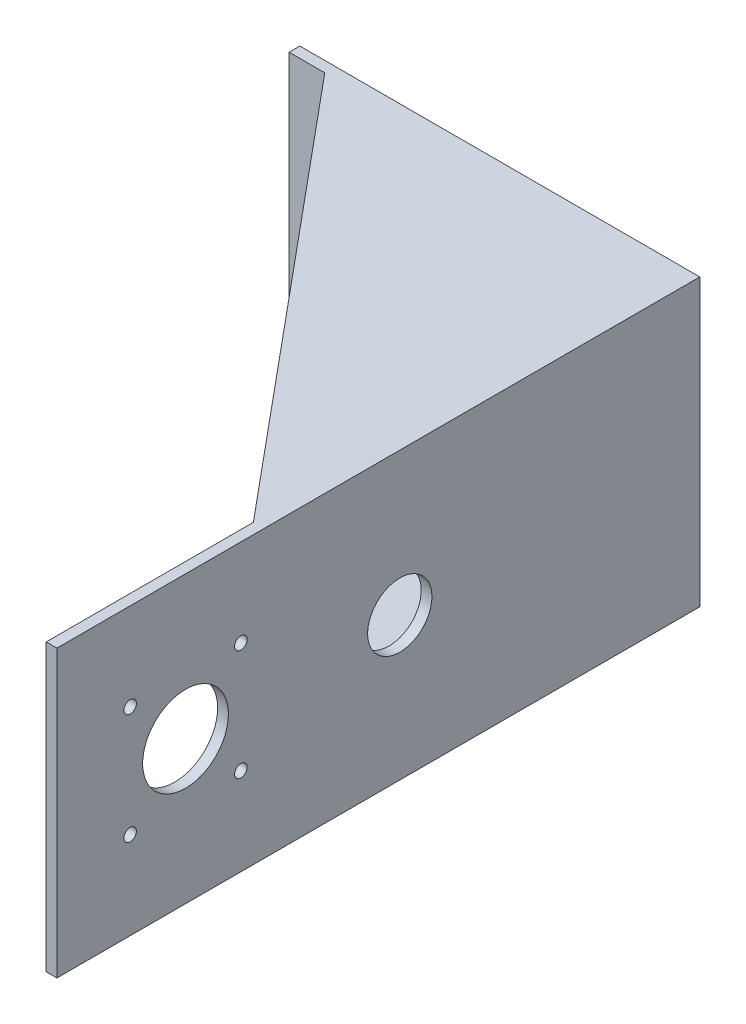
ISO-10303-21;
HEADER;
FILE_DESCRIPTION(('STEP AP214'),'2;1');
FILE_NAME('part.step','',(''),(''),'','','');
FILE_SCHEMA(('AUTOMOTIVE_DESIGN { 1 0 10303 214 1 1 1 1 }'));
ENDSEC;
DATA;
#1=APPLICATION_CONTEXT('core data for automotive mechanical design processes');
#2=APPLICATION_PROTOCOL_DEFINITION('international standard','automotive_design',2000,#1);
#3=PRODUCT_CONTEXT('',#1,'mechanical');
#4=PRODUCT('Part','Part','',(#3));
#5=PRODUCT_RELATED_PRODUCT_CATEGORY('part','',(#4));
#6=PRODUCT_DEFINITION_FORMATION('','',#4);
#7=PRODUCT_DEFINITION_CONTEXT('part definition',#1,'design');
#8=PRODUCT_DEFINITION('design','',#6,#7);
#9=PRODUCT_DEFINITION_SHAPE('','',#8);
#10=(LENGTH_UNIT() NAMED_UNIT(*) SI_UNIT(.MILLI.,.METRE.));
#11=(NAMED_UNIT(*) PLANE_ANGLE_UNIT() SI_UNIT($,.RADIAN.));
#12=(NAMED_UNIT(*) SI_UNIT($,.STERADIAN.) SOLID_ANGLE_UNIT());
#13=UNCERTAINTY_MEASURE_WITH_UNIT(LENGTH_MEASURE(1.E-05),#10,'distance_accuracy_value','');
#14=(GEOMETRIC_REPRESENTATION_CONTEXT(3) GLOBAL_UNCERTAINTY_ASSIGNED_CONTEXT((#13)) GLOBAL_UNIT_ASSIGNED_CONTEXT((#10,
#11,#12)) REPRESENTATION_CONTEXT('',''));
#15=CARTESIAN_POINT('',(0.,0.,0.));
#16=DIRECTION('',(0.,0.,1.));
#17=DIRECTION('',(1.,0.,0.));
#18=AXIS2_PLACEMENT_3D('',#15,#16,#17);
#19=CARTESIAN_POINT('',(25.,40.,0.001899999999978));
#20=DIRECTION('',(0.,0.,1.));
#21=DIRECTION('',(1.,0.,0.));
#22=AXIS2_PLACEMENT_3D('',#19,#20,#21);
#23=CYLINDRICAL_SURFACE('',#22,2.75);
#24=CARTESIAN_POINT('',(25.,40.,0.001899999999978));
#25=DIRECTION('',(0.,0.,1.));
#26=DIRECTION('',(1.,0.,0.));
#27=AXIS2_PLACEMENT_3D('',#24,#25,#26);
#28=CIRCLE('',#27,2.75);
#29=CARTESIAN_POINT('',(27.75,40.,0.001899999999978));
#30=VERTEX_POINT('',#29);
#31=EDGE_CURVE('E158',#30,#30,#28,.F.);
#32=ORIENTED_EDGE('',*,*,#31,.T.);
#33=EDGE_LOOP('',(#32));
#34=FACE_BOUND('',#33,.T.);
#35=CARTESIAN_POINT('',(25.,40.,3.0019));
#36=DIRECTION('',(0.,0.,1.));
#37=DIRECTION('',(1.,0.,0.));
#38=AXIS2_PLACEMENT_3D('',#35,#36,#37);
#39=CIRCLE('',#38,2.75);
#40=CARTESIAN_POINT('',(27.75,40.,3.0019));
#41=VERTEX_POINT('',#40);
#42=EDGE_CURVE('E18',#41,#41,#39,.F.);
#43=ORIENTED_EDGE('',*,*,#42,.F.);
#44=EDGE_LOOP('',(#43));
#45=FACE_BOUND('',#44,.T.);
#46=ADVANCED_FACE('F15',(#34,#45),#23,.F.);
#47=CARTESIAN_POINT('',(85.,40.,0.001899999999978));
#48=DIRECTION('',(0.,0.,1.));
#49=DIRECTION('',(1.,0.,0.));
#50=AXIS2_PLACEMENT_3D('',#47,#48,#49);
#51=CYLINDRICAL_SURFACE('',#50,2.75);
#52=CARTESIAN_POINT('',(85.,40.,0.001899999999978));
#53=DIRECTION('',(0.,0.,1.));
#54=DIRECTION('',(1.,0.,0.));
#55=AXIS2_PLACEMENT_3D('',#52,#53,#54);
#56=CIRCLE('',#55,2.75);
#57=CARTESIAN_POINT('',(87.75,40.,0.001899999999978));
#58=VERTEX_POINT('',#57);
#59=EDGE_CURVE('E154',#58,#58,#56,.F.);
#60=ORIENTED_EDGE('',*,*,#59,.T.);
#61=EDGE_LOOP('',(#60));
#62=FACE_BOUND('',#61,.T.);
#63=CARTESIAN_POINT('',(85.,40.,3.0019));
#64=DIRECTION('',(0.,0.,1.));
#65=DIRECTION('',(1.,0.,0.));
#66=AXIS2_PLACEMENT_3D('',#63,#64,#65);
#67=CIRCLE('',#66,2.75);
#68=CARTESIAN_POINT('',(87.75,40.,3.0019));
#69=VERTEX_POINT('',#68);
#70=EDGE_CURVE('E161',#69,#69,#67,.F.);
#71=ORIENTED_EDGE('',*,*,#70,.F.);
#72=EDGE_LOOP('',(#71));
#73=FACE_BOUND('',#72,.T.);
#74=ADVANCED_FACE('F171',(#62,#73),#51,.F.);
#75=CARTESIAN_POINT('',(0.,0.,0.001899999999978));
#76=DIRECTION('',(1.,0.,0.));
#77=DIRECTION('',(0.,0.,-1.));
#78=AXIS2_PLACEMENT_3D('',#75,#76,#77);
#79=PLANE('',#78);
#80=DIRECTION('',(0.,0.,1.));
#81=VECTOR('',#80,1.);
#82=CARTESIAN_POINT('',(0.,80.,0.001899999999978));
#83=LINE('',#82,#81);
#84=CARTESIAN_POINT('',(0.,80.,0.001899999999978));
#85=VERTEX_POINT('',#84);
#86=CARTESIAN_POINT('',(0.,80.,3.0019));
#87=VERTEX_POINT('',#86);
#88=EDGE_CURVE('E250',#85,#87,#83,.T.);
#89=ORIENTED_EDGE('',*,*,#88,.F.);
#90=DIRECTION('',(0.,1.,0.));
#91=VECTOR('',#90,1.);
#92=CARTESIAN_POINT('',(0.,0.,0.001899999999978));
#93=LINE('',#92,#91);
#94=CARTESIAN_POINT('',(0.,0.,0.001899999999978));
#95=VERTEX_POINT('',#94);
#96=EDGE_CURVE('E252',#85,#95,#93,.F.);
#97=ORIENTED_EDGE('',*,*,#96,.T.);
#98=DIRECTION('',(0.,0.,1.));
#99=VECTOR('',#98,1.);
#100=CARTESIAN_POINT('',(0.,0.,0.001899999999978));
#101=LINE('',#100,#99);
#102=CARTESIAN_POINT('',(0.,0.,3.0019));
#103=VERTEX_POINT('',#102);
#104=EDGE_CURVE('E271',#95,#103,#101,.T.);
#105=ORIENTED_EDGE('',*,*,#104,.T.);
#106=DIRECTION('',(0.,1.,0.));
#107=VECTOR('',#106,1.);
#108=CARTESIAN_POINT('',(0.,0.,3.0019));
#109=LINE('',#108,#107);
#110=EDGE_CURVE('E103',#87,#103,#109,.F.);
#111=ORIENTED_EDGE('',*,*,#110,.F.);
#112=EDGE_LOOP('',(#89,#97,#105,#111));
#113=FACE_BOUND('',#112,.T.);
#114=ADVANCED_FACE('F177',(#113),#79,.F.);
#115=CARTESIAN_POINT('',(109.,3.,122.0019));
#116=DIRECTION('',(0.768750532261908,0.,-0.639548762133923));
#117=DIRECTION('',(-0.639548762133923,0.,-0.768750532261908));
#118=AXIS2_PLACEMENT_3D('',#115,#116,#117);
#119=PLANE('',#118);
#120=DIRECTION('',(0.,1.,0.));
#121=VECTOR('',#120,1.);
#122=CARTESIAN_POINT('',(10.,0.,3.0019));
#123=LINE('',#122,#121);
#124=CARTESIAN_POINT('',(9.99999999999693,0.,3.00190000000257));
#125=VERTEX_POINT('',#124);
#126=CARTESIAN_POINT('',(9.99999999999691,3.,3.00190000000254));
#127=VERTEX_POINT('',#126);
#128=EDGE_CURVE('E97',#125,#127,#123,.T.);
#129=ORIENTED_EDGE('',*,*,#128,.F.);
#130=DIRECTION('',(-0.639548762133884,0.,-0.768750532261941));
#131=VECTOR('',#130,1.);
#132=CARTESIAN_POINT('',(109.,1.136868377216E-13,122.0019));
#133=LINE('',#132,#131);
#134=CARTESIAN_POINT('',(109.,0.,122.0019));
#135=VERTEX_POINT('',#134);
#136=EDGE_CURVE('E273',#135,#125,#133,.T.);
#137=ORIENTED_EDGE('',*,*,#136,.F.);
#138=DIRECTION('',(0.,1.,0.));
#139=VECTOR('',#138,1.);
#140=CARTESIAN_POINT('',(109.,0.,122.0019));
#141=LINE('',#140,#139);
#142=CARTESIAN_POINT('',(109.,3.,122.0019));
#143=VERTEX_POINT('',#142);
#144=EDGE_CURVE('E100',#135,#143,#141,.T.);
#145=ORIENTED_EDGE('',*,*,#144,.T.);
#146=DIRECTION('',(-0.639548762133884,0.,-0.768750532261941));
#147=VECTOR('',#146,1.);
#148=CARTESIAN_POINT('',(109.,3.,122.0019));
#149=LINE('',#148,#147);
#150=EDGE_CURVE('E93',#143,#127,#149,.T.);
#151=ORIENTED_EDGE('',*,*,#150,.T.);
#152=EDGE_LOOP('',(#129,#137,#145,#151));
#153=FACE_BOUND('',#152,.T.);
#154=ADVANCED_FACE('F95',(#153),#119,.F.);
#155=CARTESIAN_POINT('',(75.300839802394,3.,46.701060197606));
#156=DIRECTION('',(0.,-1.,0.));
#157=DIRECTION('',(0.,0.,-1.));
#158=AXIS2_PLACEMENT_3D('',#155,#156,#157);
#159=PLANE('',#158);
#160=DIRECTION('',(0.,0.,-1.));
#161=VECTOR('',#160,1.);
#162=CARTESIAN_POINT('',(109.,3.,3.0019));
#163=LINE('',#162,#161);
#164=CARTESIAN_POINT('',(109.,3.,3.0019));
#165=VERTEX_POINT('',#164);
#166=EDGE_CURVE('E108',#143,#165,#163,.T.);
#167=ORIENTED_EDGE('',*,*,#166,.T.);
#168=DIRECTION('',(1.,0.,0.));
#169=VECTOR('',#168,1.);
#170=CARTESIAN_POINT('',(0.,3.,3.0019));
#171=LINE('',#170,#169);
#172=EDGE_CURVE('E106',#127,#165,#171,.T.);
#173=ORIENTED_EDGE('',*,*,#172,.F.);
#174=ORIENTED_EDGE('',*,*,#150,.F.);
#175=EDGE_LOOP('',(#167,#173,#174));
#176=FACE_BOUND('',#175,.T.);
#177=ADVANCED_FACE('F107',(#176),#159,.F.);
#178=CARTESIAN_POINT('',(0.,0.,3.0019));
#179=DIRECTION('',(0.,0.,1.));
#180=DIRECTION('',(1.,0.,0.));
#181=AXIS2_PLACEMENT_3D('',#178,#179,#180);
#182=PLANE('',#181);
#183=ORIENTED_EDGE('',*,*,#70,.T.);
#184=EDGE_LOOP('',(#183));
#185=FACE_BOUND('',#184,.T.);
#186=ORIENTED_EDGE('',*,*,#42,.T.);
#187=EDGE_LOOP('',(#186));
#188=FACE_BOUND('',#187,.T.);
#189=DIRECTION('',(1.,0.,0.));
#190=VECTOR('',#189,1.);
#191=CARTESIAN_POINT('',(75.300839802394,77.,3.0019));
#192=LINE('',#191,#190);
#193=CARTESIAN_POINT('',(9.99999999999845,77.,3.00190000000128));
#194=VERTEX_POINT('',#193);
#195=CARTESIAN_POINT('',(109.,77.,3.0019));
#196=VERTEX_POINT('',#195);
#197=EDGE_CURVE('E88',#194,#196,#192,.T.);
#198=ORIENTED_EDGE('',*,*,#197,.F.);
#199=DIRECTION('',(0.,1.,0.));
#200=VECTOR('',#199,1.);
#201=CARTESIAN_POINT('',(9.99999999999383,80.,3.00190000000511));
#202=LINE('',#201,#200);
#203=CARTESIAN_POINT('',(9.99999999999923,80.,3.00190000000064));
#204=VERTEX_POINT('',#203);
#205=EDGE_CURVE('E275',#194,#204,#202,.T.);
#206=ORIENTED_EDGE('',*,*,#205,.T.);
#207=DIRECTION('',(1.,0.,0.));
#208=VECTOR('',#207,1.);
#209=CARTESIAN_POINT('',(0.,80.,3.0019));
#210=LINE('',#209,#208);
#211=EDGE_CURVE('E256',#87,#204,#210,.T.);
#212=ORIENTED_EDGE('',*,*,#211,.F.);
#213=ORIENTED_EDGE('',*,*,#110,.T.);
#214=DIRECTION('',(1.,0.,0.));
#215=VECTOR('',#214,1.);
#216=CARTESIAN_POINT('',(0.,0.,3.0019));
#217=LINE('',#216,#215);
#218=EDGE_CURVE('E114',#103,#125,#217,.T.);
#219=ORIENTED_EDGE('',*,*,#218,.T.);
#220=ORIENTED_EDGE('',*,*,#128,.T.);
#221=ORIENTED_EDGE('',*,*,#172,.T.);
#222=DIRECTION('',(0.,1.,0.));
#223=VECTOR('',#222,1.);
#224=CARTESIAN_POINT('',(109.,0.,3.0019));
#225=LINE('',#224,#223);
#226=EDGE_CURVE('E290',#165,#196,#225,.T.);
#227=ORIENTED_EDGE('',*,*,#226,.T.);
#228=EDGE_LOOP('',(#198,#206,#212,#213,#219,#220,#221,#227));
#229=FACE_BOUND('',#228,.T.);
#230=ADVANCED_FACE('F111',(#185,#188,#229),#182,.T.);
#231=CARTESIAN_POINT('',(75.300839802394,77.,46.701060197606));
#232=DIRECTION('',(0.,-1.,0.));
#233=DIRECTION('',(0.,0.,-1.));
#234=AXIS2_PLACEMENT_3D('',#231,#232,#233);
#235=PLANE('',#234);
#236=DIRECTION('',(0.,0.,-1.));
#237=VECTOR('',#236,1.);
#238=CARTESIAN_POINT('',(109.,77.,3.0019));
#239=LINE('',#238,#237);
#240=CARTESIAN_POINT('',(109.,77.,122.0019));
#241=VERTEX_POINT('',#240);
#242=EDGE_CURVE('E280',#196,#241,#239,.F.);
#243=ORIENTED_EDGE('',*,*,#242,.T.);
#244=DIRECTION('',(-0.639548762133923,0.,-0.768750532261908));
#245=VECTOR('',#244,1.);
#246=CARTESIAN_POINT('',(109.,77.,122.0019));
#247=LINE('',#246,#245);
#248=EDGE_CURVE('E165',#241,#194,#247,.T.);
#249=ORIENTED_EDGE('',*,*,#248,.T.);
#250=ORIENTED_EDGE('',*,*,#197,.T.);
#251=EDGE_LOOP('',(#243,#249,#250));
#252=FACE_BOUND('',#251,.T.);
#253=ADVANCED_FACE('F233',(#252),#235,.T.);
#254=CARTESIAN_POINT('',(109.,80.,122.0019));
#255=DIRECTION('',(0.768750532261908,0.,-0.639548762133923));
#256=DIRECTION('',(-0.639548762133923,0.,-0.768750532261908));
#257=AXIS2_PLACEMENT_3D('',#254,#255,#256);
#258=PLANE('',#257);
#259=ORIENTED_EDGE('',*,*,#205,.F.);
#260=ORIENTED_EDGE('',*,*,#248,.F.);
#261=DIRECTION('',(0.,1.,0.));
#262=VECTOR('',#261,1.);
#263=CARTESIAN_POINT('',(109.,0.,122.0019));
#264=LINE('',#263,#262);
#265=CARTESIAN_POINT('',(109.,80.,122.0019));
#266=VERTEX_POINT('',#265);
#267=EDGE_CURVE('E293',#241,#266,#264,.T.);
#268=ORIENTED_EDGE('',*,*,#267,.T.);
#269=DIRECTION('',(-0.639548762133884,0.,-0.768750532261941));
#270=VECTOR('',#269,1.);
#271=CARTESIAN_POINT('',(109.,80.,122.0019));
#272=LINE('',#271,#270);
#273=EDGE_CURVE('E284',#266,#204,#272,.T.);
#274=ORIENTED_EDGE('',*,*,#273,.T.);
#275=EDGE_LOOP('',(#259,#260,#268,#274));
#276=FACE_BOUND('',#275,.T.);
#277=ADVANCED_FACE('F229',(#276),#258,.F.);
#278=CARTESIAN_POINT('',(0.,0.,0.001899999999978));
#279=DIRECTION('',(0.,0.,1.));
#280=DIRECTION('',(1.,0.,0.));
#281=AXIS2_PLACEMENT_3D('',#278,#279,#280);
#282=PLANE('',#281);
#283=ORIENTED_EDGE('',*,*,#59,.F.);
#284=EDGE_LOOP('',(#283));
#285=FACE_BOUND('',#284,.T.);
#286=ORIENTED_EDGE('',*,*,#31,.F.);
#287=EDGE_LOOP('',(#286));
#288=FACE_BOUND('',#287,.T.);
#289=DIRECTION('',(0.,1.,0.));
#290=VECTOR('',#289,1.);
#291=CARTESIAN_POINT('',(112.,0.,0.001899999999978));
#292=LINE('',#291,#290);
#293=CARTESIAN_POINT('',(112.,0.,0.001899999999978));
#294=VERTEX_POINT('',#293);
#295=CARTESIAN_POINT('',(112.,80.,0.001899999999978));
#296=VERTEX_POINT('',#295);
#297=EDGE_CURVE('E297',#294,#296,#292,.T.);
#298=ORIENTED_EDGE('',*,*,#297,.F.);
#299=DIRECTION('',(1.,0.,0.));
#300=VECTOR('',#299,1.);
#301=CARTESIAN_POINT('',(0.,0.,0.001899999999978));
#302=LINE('',#301,#300);
#303=EDGE_CURVE('E160',#95,#294,#302,.T.);
#304=ORIENTED_EDGE('',*,*,#303,.F.);
#305=ORIENTED_EDGE('',*,*,#96,.F.);
#306=DIRECTION('',(1.,0.,0.));
#307=VECTOR('',#306,1.);
#308=CARTESIAN_POINT('',(0.,80.,0.001899999999978));
#309=LINE('',#308,#307);
#310=EDGE_CURVE('E157',#296,#85,#309,.F.);
#311=ORIENTED_EDGE('',*,*,#310,.F.);
#312=EDGE_LOOP('',(#298,#304,#305,#311));
#313=FACE_BOUND('',#312,.T.);
#314=ADVANCED_FACE('F225',(#285,#288,#313),#282,.F.);
#315=CARTESIAN_POINT('',(109.,0.,3.0019));
#316=DIRECTION('',(1.,0.,0.));
#317=DIRECTION('',(0.,0.,-1.));
#318=AXIS2_PLACEMENT_3D('',#315,#316,#317);
#319=PLANE('',#318);
#320=CARTESIAN_POINT('',(109.,24.5,159.5019));
#321=DIRECTION('',(1.,0.,0.));
#322=DIRECTION('',(0.,0.,-1.));
#323=AXIS2_PLACEMENT_3D('',#320,#321,#322);
#324=CIRCLE('',#323,1.75);
#325=CARTESIAN_POINT('',(109.,24.5,157.7519));
#326=VERTEX_POINT('',#325);
#327=EDGE_CURVE('E135',#326,#326,#324,.T.);
#328=ORIENTED_EDGE('',*,*,#327,.T.);
#329=EDGE_LOOP('',(#328));
#330=FACE_BOUND('',#329,.T.);
#331=CARTESIAN_POINT('',(109.,24.5,128.5019));
#332=DIRECTION('',(1.,0.,0.));
#333=DIRECTION('',(0.,0.,-1.));
#334=AXIS2_PLACEMENT_3D('',#331,#332,#333);
#335=CIRCLE('',#334,1.75);
#336=CARTESIAN_POINT('',(109.,24.5,126.7519));
#337=VERTEX_POINT('',#336);
#338=EDGE_CURVE('E139',#337,#337,#335,.T.);
#339=ORIENTED_EDGE('',*,*,#338,.T.);
#340=EDGE_LOOP('',(#339));
#341=FACE_BOUND('',#340,.T.);
#342=CARTESIAN_POINT('',(109.,40.,144.0019));
#343=DIRECTION('',(1.,0.,0.));
#344=DIRECTION('',(0.,0.,-1.));
#345=AXIS2_PLACEMENT_3D('',#342,#343,#344);
#346=CIRCLE('',#345,12.);
#347=CARTESIAN_POINT('',(109.,40.,132.0019));
#348=VERTEX_POINT('',#347);
#349=EDGE_CURVE('E142',#348,#348,#346,.T.);
#350=ORIENTED_EDGE('',*,*,#349,.T.);
#351=EDGE_LOOP('',(#350));
#352=FACE_BOUND('',#351,.T.);
#353=CARTESIAN_POINT('',(109.,40.,84.0019));
#354=DIRECTION('',(1.,0.,0.));
#355=DIRECTION('',(0.,0.,-1.));
#356=AXIS2_PLACEMENT_3D('',#353,#354,#355);
#357=CIRCLE('',#356,9.);
#358=CARTESIAN_POINT('',(109.,40.,75.0019));
#359=VERTEX_POINT('',#358);
#360=EDGE_CURVE('E145',#359,#359,#357,.T.);
#361=ORIENTED_EDGE('',*,*,#360,.T.);
#362=EDGE_LOOP('',(#361));
#363=FACE_BOUND('',#362,.T.);
#364=CARTESIAN_POINT('',(109.,55.5,159.5019));
#365=DIRECTION('',(1.,0.,0.));
#366=DIRECTION('',(0.,0.,-1.));
#367=AXIS2_PLACEMENT_3D('',#364,#365,#366);
#368=CIRCLE('',#367,1.75);
#369=CARTESIAN_POINT('',(109.,55.5,157.7519));
#370=VERTEX_POINT('',#369);
#371=EDGE_CURVE('E148',#370,#370,#368,.T.);
#372=ORIENTED_EDGE('',*,*,#371,.T.);
#373=EDGE_LOOP('',(#372));
#374=FACE_BOUND('',#373,.T.);
#375=CARTESIAN_POINT('',(109.,55.5,128.5019));
#376=DIRECTION('',(1.,0.,0.));
#377=DIRECTION('',(0.,0.,-1.));
#378=AXIS2_PLACEMENT_3D('',#375,#376,#377);
#379=CIRCLE('',#378,1.75);
#380=CARTESIAN_POINT('',(109.,55.5,126.7519));
#381=VERTEX_POINT('',#380);
#382=EDGE_CURVE('E151',#381,#381,#379,.T.);
#383=ORIENTED_EDGE('',*,*,#382,.T.);
#384=EDGE_LOOP('',(#383));
#385=FACE_BOUND('',#384,.T.);
#386=DIRECTION('',(0.,0.,1.));
#387=VECTOR('',#386,1.);
#388=CARTESIAN_POINT('',(109.,80.,3.0019));
#389=LINE('',#388,#387);
#390=CARTESIAN_POINT('',(109.,80.,180.0019));
#391=VERTEX_POINT('',#390);
#392=EDGE_CURVE('E299',#266,#391,#389,.T.);
#393=ORIENTED_EDGE('',*,*,#392,.F.);
#394=ORIENTED_EDGE('',*,*,#267,.F.);
#395=ORIENTED_EDGE('',*,*,#242,.F.);
#396=ORIENTED_EDGE('',*,*,#226,.F.);
#397=ORIENTED_EDGE('',*,*,#166,.F.);
#398=ORIENTED_EDGE('',*,*,#144,.F.);
#399=DIRECTION('',(0.,0.,1.));
#400=VECTOR('',#399,1.);
#401=CARTESIAN_POINT('',(109.,0.,3.0019));
#402=LINE('',#401,#400);
#403=CARTESIAN_POINT('',(109.,0.,180.0019));
#404=VERTEX_POINT('',#403);
#405=EDGE_CURVE('E295',#135,#404,#402,.T.);
#406=ORIENTED_EDGE('',*,*,#405,.T.);
#407=DIRECTION('',(0.,1.,0.));
#408=VECTOR('',#407,1.);
#409=CARTESIAN_POINT('',(109.,0.,180.0019));
#410=LINE('',#409,#408);
#411=EDGE_CURVE('E301',#391,#404,#410,.F.);
#412=ORIENTED_EDGE('',*,*,#411,.F.);
#413=EDGE_LOOP('',(#393,#394,#395,#396,#397,#398,#406,#412));
#414=FACE_BOUND('',#413,.T.);
#415=ADVANCED_FACE('F221',(#330,#341,#352,#363,#374,#385,#414),#319,.F.);
#416=CARTESIAN_POINT('',(109.,0.,3.0019));
#417=DIRECTION('',(0.,1.,0.));
#418=DIRECTION('',(0.,0.,1.));
#419=AXIS2_PLACEMENT_3D('',#416,#417,#418);
#420=PLANE('',#419);
#421=DIRECTION('',(1.,0.,0.));
#422=VECTOR('',#421,1.);
#423=CARTESIAN_POINT('',(109.,0.,180.0019));
#424=LINE('',#423,#422);
#425=CARTESIAN_POINT('',(112.,0.,180.0019));
#426=VERTEX_POINT('',#425);
#427=EDGE_CURVE('E304',#404,#426,#424,.T.);
#428=ORIENTED_EDGE('',*,*,#427,.F.);
#429=ORIENTED_EDGE('',*,*,#405,.F.);
#430=ORIENTED_EDGE('',*,*,#136,.T.);
#431=ORIENTED_EDGE('',*,*,#218,.F.);
#432=ORIENTED_EDGE('',*,*,#104,.F.);
#433=ORIENTED_EDGE('',*,*,#303,.T.);
#434=DIRECTION('',(0.,0.,-1.));
#435=VECTOR('',#434,1.);
#436=CARTESIAN_POINT('',(112.,0.,3.0019));
#437=LINE('',#436,#435);
#438=EDGE_CURVE('E138',#426,#294,#437,.T.);
#439=ORIENTED_EDGE('',*,*,#438,.F.);
#440=EDGE_LOOP('',(#428,#429,#430,#431,#432,#433,#439));
#441=FACE_BOUND('',#440,.T.);
#442=ADVANCED_FACE('F218',(#441),#420,.F.);
#443=CARTESIAN_POINT('',(109.,80.,3.0019));
#444=DIRECTION('',(0.,1.,0.));
#445=DIRECTION('',(0.,0.,1.));
#446=AXIS2_PLACEMENT_3D('',#443,#444,#445);
#447=PLANE('',#446);
#448=DIRECTION('',(1.,0.,0.));
#449=VECTOR('',#448,1.);
#450=CARTESIAN_POINT('',(109.,80.,180.0019));
#451=LINE('',#450,#449);
#452=CARTESIAN_POINT('',(112.,80.,180.0019));
#453=VERTEX_POINT('',#452);
#454=EDGE_CURVE('E33',#453,#391,#451,.F.);
#455=ORIENTED_EDGE('',*,*,#454,.F.);
#456=DIRECTION('',(0.,0.,-1.));
#457=VECTOR('',#456,1.);
#458=CARTESIAN_POINT('',(112.,80.,3.0019));
#459=LINE('',#458,#457);
#460=EDGE_CURVE('E260',#296,#453,#459,.F.);
#461=ORIENTED_EDGE('',*,*,#460,.F.);
#462=ORIENTED_EDGE('',*,*,#310,.T.);
#463=ORIENTED_EDGE('',*,*,#88,.T.);
#464=ORIENTED_EDGE('',*,*,#211,.T.);
#465=ORIENTED_EDGE('',*,*,#273,.F.);
#466=ORIENTED_EDGE('',*,*,#392,.T.);
#467=EDGE_LOOP('',(#455,#461,#462,#463,#464,#465,#466));
#468=FACE_BOUND('',#467,.T.);
#469=ADVANCED_FACE('F214',(#468),#447,.T.);
#470=CARTESIAN_POINT('',(109.,0.,180.0019));
#471=DIRECTION('',(0.,0.,1.));
#472=DIRECTION('',(1.,0.,0.));
#473=AXIS2_PLACEMENT_3D('',#470,#471,#472);
#474=PLANE('',#473);
#475=DIRECTION('',(0.,1.,0.));
#476=VECTOR('',#475,1.);
#477=CARTESIAN_POINT('',(112.,0.,180.0019));
#478=LINE('',#477,#476);
#479=EDGE_CURVE('E134',#453,#426,#478,.F.);
#480=ORIENTED_EDGE('',*,*,#479,.F.);
#481=ORIENTED_EDGE('',*,*,#454,.T.);
#482=ORIENTED_EDGE('',*,*,#411,.T.);
#483=ORIENTED_EDGE('',*,*,#427,.T.);
#484=EDGE_LOOP('',(#480,#481,#482,#483));
#485=FACE_BOUND('',#484,.T.);
#486=ADVANCED_FACE('F210',(#485),#474,.T.);
#487=CARTESIAN_POINT('',(109.,55.5,128.5019));
#488=DIRECTION('',(1.,0.,0.));
#489=DIRECTION('',(0.,0.,-1.));
#490=AXIS2_PLACEMENT_3D('',#487,#488,#489);
#491=CYLINDRICAL_SURFACE('',#490,1.75);
#492=ORIENTED_EDGE('',*,*,#382,.F.);
#493=EDGE_LOOP('',(#492));
#494=FACE_BOUND('',#493,.T.);
#495=CARTESIAN_POINT('',(112.,55.5,128.5019));
#496=DIRECTION('',(1.,0.,0.));
#497=DIRECTION('',(0.,0.,-1.));
#498=AXIS2_PLACEMENT_3D('',#495,#496,#497);
#499=CIRCLE('',#498,1.75);
#500=CARTESIAN_POINT('',(112.,55.5,126.7519));
#501=VERTEX_POINT('',#500);
#502=EDGE_CURVE('E131',#501,#501,#499,.F.);
#503=ORIENTED_EDGE('',*,*,#502,.F.);
#504=EDGE_LOOP('',(#503));
#505=FACE_BOUND('',#504,.T.);
#506=ADVANCED_FACE('F206',(#494,#505),#491,.F.);
#507=CARTESIAN_POINT('',(109.,55.5,159.5019));
#508=DIRECTION('',(1.,0.,0.));
#509=DIRECTION('',(0.,0.,-1.));
#510=AXIS2_PLACEMENT_3D('',#507,#508,#509);
#511=CYLINDRICAL_SURFACE('',#510,1.75);
#512=ORIENTED_EDGE('',*,*,#371,.F.);
#513=EDGE_LOOP('',(#512));
#514=FACE_BOUND('',#513,.T.);
#515=CARTESIAN_POINT('',(112.,55.5,159.5019));
#516=DIRECTION('',(1.,0.,0.));
#517=DIRECTION('',(0.,0.,-1.));
#518=AXIS2_PLACEMENT_3D('',#515,#516,#517);
#519=CIRCLE('',#518,1.75);
#520=CARTESIAN_POINT('',(112.,55.5,157.7519));
#521=VERTEX_POINT('',#520);
#522=EDGE_CURVE('E128',#521,#521,#519,.F.);
#523=ORIENTED_EDGE('',*,*,#522,.F.);
#524=EDGE_LOOP('',(#523));
#525=FACE_BOUND('',#524,.T.);
#526=ADVANCED_FACE('F202',(#514,#525),#511,.F.);
#527=CARTESIAN_POINT('',(109.,40.,84.0019));
#528=DIRECTION('',(1.,0.,0.));
#529=DIRECTION('',(0.,0.,-1.));
#530=AXIS2_PLACEMENT_3D('',#527,#528,#529);
#531=CYLINDRICAL_SURFACE('',#530,9.);
#532=ORIENTED_EDGE('',*,*,#360,.F.);
#533=EDGE_LOOP('',(#532));
#534=FACE_BOUND('',#533,.T.);
#535=CARTESIAN_POINT('',(112.,40.,84.0019));
#536=DIRECTION('',(1.,0.,0.));
#537=DIRECTION('',(0.,0.,-1.));
#538=AXIS2_PLACEMENT_3D('',#535,#536,#537);
#539=CIRCLE('',#538,9.);
#540=CARTESIAN_POINT('',(112.,40.,75.0019));
#541=VERTEX_POINT('',#540);
#542=EDGE_CURVE('E125',#541,#541,#539,.F.);
#543=ORIENTED_EDGE('',*,*,#542,.F.);
#544=EDGE_LOOP('',(#543));
#545=FACE_BOUND('',#544,.T.);
#546=ADVANCED_FACE('F198',(#534,#545),#531,.F.);
#547=CARTESIAN_POINT('',(109.,40.,144.0019));
#548=DIRECTION('',(1.,0.,0.));
#549=DIRECTION('',(0.,0.,-1.));
#550=AXIS2_PLACEMENT_3D('',#547,#548,#549);
#551=CYLINDRICAL_SURFACE('',#550,12.);
#552=ORIENTED_EDGE('',*,*,#349,.F.);
#553=EDGE_LOOP('',(#552));
#554=FACE_BOUND('',#553,.T.);
#555=CARTESIAN_POINT('',(112.,40.,144.0019));
#556=DIRECTION('',(1.,0.,0.));
#557=DIRECTION('',(0.,0.,-1.));
#558=AXIS2_PLACEMENT_3D('',#555,#556,#557);
#559=CIRCLE('',#558,12.);
#560=CARTESIAN_POINT('',(112.,40.,132.0019));
#561=VERTEX_POINT('',#560);
#562=EDGE_CURVE('E122',#561,#561,#559,.F.);
#563=ORIENTED_EDGE('',*,*,#562,.F.);
#564=EDGE_LOOP('',(#563));
#565=FACE_BOUND('',#564,.T.);
#566=ADVANCED_FACE('F194',(#554,#565),#551,.F.);
#567=CARTESIAN_POINT('',(109.,24.5,128.5019));
#568=DIRECTION('',(1.,0.,0.));
#569=DIRECTION('',(0.,0.,-1.));
#570=AXIS2_PLACEMENT_3D('',#567,#568,#569);
#571=CYLINDRICAL_SURFACE('',#570,1.75);
#572=ORIENTED_EDGE('',*,*,#338,.F.);
#573=EDGE_LOOP('',(#572));
#574=FACE_BOUND('',#573,.T.);
#575=CARTESIAN_POINT('',(112.,24.5,128.5019));
#576=DIRECTION('',(1.,0.,0.));
#577=DIRECTION('',(0.,0.,-1.));
#578=AXIS2_PLACEMENT_3D('',#575,#576,#577);
#579=CIRCLE('',#578,1.75);
#580=CARTESIAN_POINT('',(112.,24.5,126.7519));
#581=VERTEX_POINT('',#580);
#582=EDGE_CURVE('E24',#581,#581,#579,.F.);
#583=ORIENTED_EDGE('',*,*,#582,.F.);
#584=EDGE_LOOP('',(#583));
#585=FACE_BOUND('',#584,.T.);
#586=ADVANCED_FACE('F187',(#574,#585),#571,.F.);
#587=CARTESIAN_POINT('',(109.,24.5,159.5019));
#588=DIRECTION('',(1.,0.,0.));
#589=DIRECTION('',(0.,0.,-1.));
#590=AXIS2_PLACEMENT_3D('',#587,#588,#589);
#591=CYLINDRICAL_SURFACE('',#590,1.75);
#592=ORIENTED_EDGE('',*,*,#327,.F.);
#593=EDGE_LOOP('',(#592));
#594=FACE_BOUND('',#593,.T.);
#595=CARTESIAN_POINT('',(112.,24.5,159.5019));
#596=DIRECTION('',(1.,0.,0.));
#597=DIRECTION('',(0.,0.,-1.));
#598=AXIS2_PLACEMENT_3D('',#595,#596,#597);
#599=CIRCLE('',#598,1.75);
#600=CARTESIAN_POINT('',(112.,24.5,157.7519));
#601=VERTEX_POINT('',#600);
#602=EDGE_CURVE('E9',#601,#601,#599,.F.);
#603=ORIENTED_EDGE('',*,*,#602,.F.);
#604=EDGE_LOOP('',(#603));
#605=FACE_BOUND('',#604,.T.);
#606=ADVANCED_FACE('F181',(#594,#605),#591,.F.);
#607=CARTESIAN_POINT('',(112.,0.,3.0019));
#608=DIRECTION('',(1.,0.,0.));
#609=DIRECTION('',(0.,0.,-1.));
#610=AXIS2_PLACEMENT_3D('',#607,#608,#609);
#611=PLANE('',#610);
#612=ORIENTED_EDGE('',*,*,#602,.T.);
#613=EDGE_LOOP('',(#612));
#614=FACE_BOUND('',#613,.T.);
#615=ORIENTED_EDGE('',*,*,#582,.T.);
#616=EDGE_LOOP('',(#615));
#617=FACE_BOUND('',#616,.T.);
#618=ORIENTED_EDGE('',*,*,#562,.T.);
#619=EDGE_LOOP('',(#618));
#620=FACE_BOUND('',#619,.T.);
#621=ORIENTED_EDGE('',*,*,#542,.T.);
#622=EDGE_LOOP('',(#621));
#623=FACE_BOUND('',#622,.T.);
#624=ORIENTED_EDGE('',*,*,#522,.T.);
#625=EDGE_LOOP('',(#624));
#626=FACE_BOUND('',#625,.T.);
#627=ORIENTED_EDGE('',*,*,#502,.T.);
#628=EDGE_LOOP('',(#627));
#629=FACE_BOUND('',#628,.T.);
#630=ORIENTED_EDGE('',*,*,#460,.T.);
#631=ORIENTED_EDGE('',*,*,#479,.T.);
#632=ORIENTED_EDGE('',*,*,#438,.T.);
#633=ORIENTED_EDGE('',*,*,#297,.T.);
#634=EDGE_LOOP('',(#630,#631,#632,#633));
#635=FACE_BOUND('',#634,.T.);
#636=ADVANCED_FACE('F179',(#614,#617,#620,#623,#626,#629,#635),#611,.T.);
#637=CLOSED_SHELL('',(#46,#74,#114,#154,#177,#230,#253,#277,#314,#415,#442,#469,#486,#506,#526,
#546,#566,#586,#606,#636));
#638=MANIFOLD_SOLID_BREP('B1',#637);
#639=ADVANCED_BREP_SHAPE_REPRESENTATION('',(#18,#638),#14);
#640=SHAPE_DEFINITION_REPRESENTATION(#9,#639);
ENDSEC;
END-ISO-10303-21;
